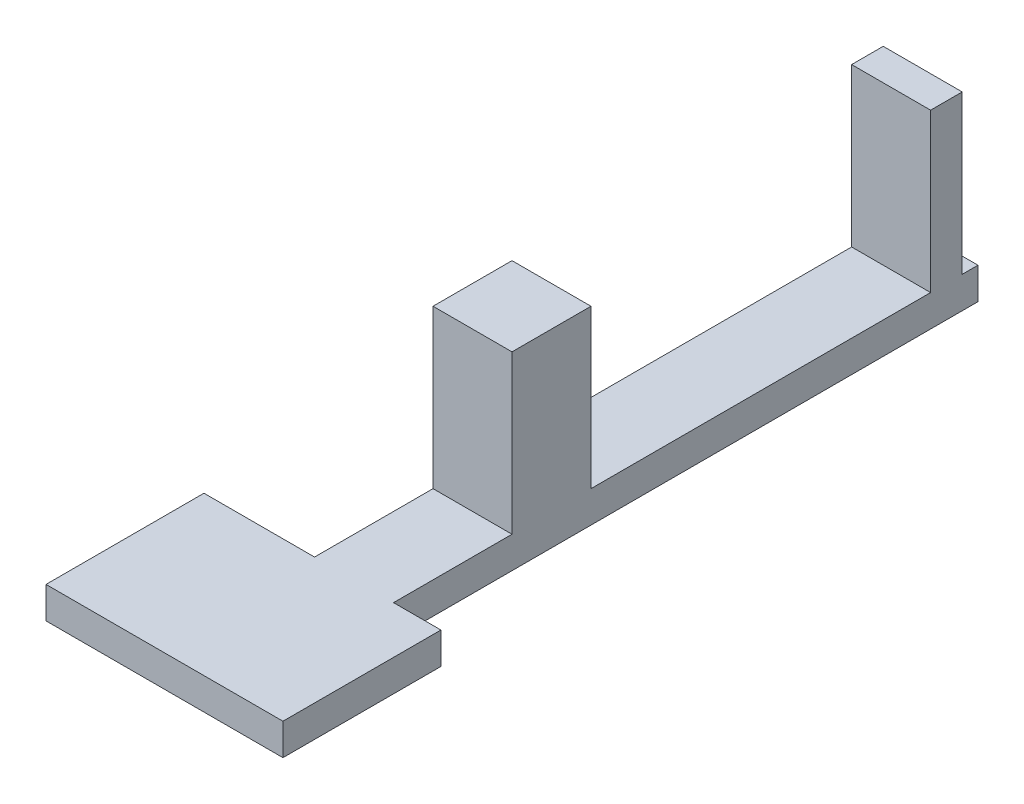
ISO-10303-21;
HEADER;
FILE_DESCRIPTION(('STEP AP214'),'2;1');
FILE_NAME('part.step','',(''),(''),'','','');
FILE_SCHEMA(('AUTOMOTIVE_DESIGN { 1 0 10303 214 1 1 1 1 }'));
ENDSEC;
DATA;
#1=APPLICATION_CONTEXT('core data for automotive mechanical design processes');
#2=APPLICATION_PROTOCOL_DEFINITION('international standard','automotive_design',2000,#1);
#3=PRODUCT_CONTEXT('',#1,'mechanical');
#4=PRODUCT('Part','Part','',(#3));
#5=PRODUCT_RELATED_PRODUCT_CATEGORY('part','',(#4));
#6=PRODUCT_DEFINITION_FORMATION('','',#4);
#7=PRODUCT_DEFINITION_CONTEXT('part definition',#1,'design');
#8=PRODUCT_DEFINITION('design','',#6,#7);
#9=PRODUCT_DEFINITION_SHAPE('','',#8);
#10=(LENGTH_UNIT() NAMED_UNIT(*) SI_UNIT(.MILLI.,.METRE.));
#11=(NAMED_UNIT(*) PLANE_ANGLE_UNIT() SI_UNIT($,.RADIAN.));
#12=(NAMED_UNIT(*) SI_UNIT($,.STERADIAN.) SOLID_ANGLE_UNIT());
#13=UNCERTAINTY_MEASURE_WITH_UNIT(LENGTH_MEASURE(1.E-05),#10,'distance_accuracy_value','');
#14=(GEOMETRIC_REPRESENTATION_CONTEXT(3) GLOBAL_UNCERTAINTY_ASSIGNED_CONTEXT((#13)) GLOBAL_UNIT_ASSIGNED_CONTEXT((#10,
#11,#12)) REPRESENTATION_CONTEXT('',''));
#15=CARTESIAN_POINT('',(0.,0.,0.));
#16=DIRECTION('',(0.,0.,1.));
#17=DIRECTION('',(1.,0.,0.));
#18=AXIS2_PLACEMENT_3D('',#15,#16,#17);
#19=CARTESIAN_POINT('',(-25.,10.,470.));
#20=DIRECTION('',(0.,-1.,0.));
#21=DIRECTION('',(0.,0.,-1.));
#22=AXIS2_PLACEMENT_3D('',#19,#20,#21);
#23=PLANE('',#22);
#24=DIRECTION('',(-1.,0.,0.));
#25=VECTOR('',#24,1.);
#26=CARTESIAN_POINT('',(-25.,10.,245.));
#27=LINE('',#26,#25);
#28=CARTESIAN_POINT('',(25.,10.,245.));
#29=VERTEX_POINT('',#28);
#30=CARTESIAN_POINT('',(-25.,10.,245.));
#31=VERTEX_POINT('',#30);
#32=EDGE_CURVE('E162',#29,#31,#27,.T.);
#33=ORIENTED_EDGE('',*,*,#32,.F.);
#34=DIRECTION('',(0.,0.,-1.));
#35=VECTOR('',#34,1.);
#36=CARTESIAN_POINT('',(25.,10.,470.));
#37=LINE('',#36,#35);
#38=CARTESIAN_POINT('',(25.,10.,30.0000000000001));
#39=VERTEX_POINT('',#38);
#40=EDGE_CURVE('E45',#29,#39,#37,.T.);
#41=ORIENTED_EDGE('',*,*,#40,.T.);
#42=DIRECTION('',(1.,0.,0.));
#43=VECTOR('',#42,1.);
#44=CARTESIAN_POINT('',(-25.,10.,30.));
#45=LINE('',#44,#43);
#46=CARTESIAN_POINT('',(-25.,10.,30.0000000000001));
#47=VERTEX_POINT('',#46);
#48=EDGE_CURVE('E475',#47,#39,#45,.T.);
#49=ORIENTED_EDGE('',*,*,#48,.F.);
#50=DIRECTION('',(0.,0.,-1.));
#51=VECTOR('',#50,1.);
#52=CARTESIAN_POINT('',(-25.,10.,470.));
#53=LINE('',#52,#51);
#54=EDGE_CURVE('E216',#31,#47,#53,.T.);
#55=ORIENTED_EDGE('',*,*,#54,.F.);
#56=EDGE_LOOP('',(#33,#41,#49,#55));
#57=FACE_BOUND('',#56,.T.);
#58=ADVANCED_FACE('F37',(#57),#23,.F.);
#59=DIRECTION('',(1.,0.,0.));
#60=VECTOR('',#59,1.);
#61=CARTESIAN_POINT('',(-25.,10.,295.));
#62=LINE('',#61,#60);
#63=CARTESIAN_POINT('',(-25.,10.,295.));
#64=VERTEX_POINT('',#63);
#65=CARTESIAN_POINT('',(25.,10.,295.));
#66=VERTEX_POINT('',#65);
#67=EDGE_CURVE('E152',#64,#66,#62,.T.);
#68=ORIENTED_EDGE('',*,*,#67,.F.);
#69=CARTESIAN_POINT('',(-25.,10.,370.));
#70=VERTEX_POINT('',#69);
#71=EDGE_CURVE('E215',#70,#64,#53,.T.);
#72=ORIENTED_EDGE('',*,*,#71,.F.);
#73=DIRECTION('',(-1.,0.,0.));
#74=VECTOR('',#73,1.);
#75=CARTESIAN_POINT('',(55.,10.,370.));
#76=LINE('',#75,#74);
#77=CARTESIAN_POINT('',(-95.,10.,370.));
#78=VERTEX_POINT('',#77);
#79=EDGE_CURVE('E181',#70,#78,#76,.T.);
#80=ORIENTED_EDGE('',*,*,#79,.T.);
#81=DIRECTION('',(0.,0.,1.));
#82=VECTOR('',#81,1.);
#83=CARTESIAN_POINT('',(-95.,10.,370.));
#84=LINE('',#83,#82);
#85=CARTESIAN_POINT('',(-94.9999999999999,10.,470.));
#86=VERTEX_POINT('',#85);
#87=EDGE_CURVE('E242',#78,#86,#84,.T.);
#88=ORIENTED_EDGE('',*,*,#87,.T.);
#89=DIRECTION('',(-1.,0.,0.));
#90=VECTOR('',#89,1.);
#91=CARTESIAN_POINT('',(-25.,10.,470.));
#92=LINE('',#91,#90);
#93=CARTESIAN_POINT('',(55.,10.,470.));
#94=VERTEX_POINT('',#93);
#95=EDGE_CURVE('E199',#94,#86,#92,.T.);
#96=ORIENTED_EDGE('',*,*,#95,.F.);
#97=DIRECTION('',(0.,0.,-1.));
#98=VECTOR('',#97,1.);
#99=CARTESIAN_POINT('',(55.,10.,370.));
#100=LINE('',#99,#98);
#101=CARTESIAN_POINT('',(55.,10.,370.));
#102=VERTEX_POINT('',#101);
#103=EDGE_CURVE('E178',#94,#102,#100,.T.);
#104=ORIENTED_EDGE('',*,*,#103,.T.);
#105=CARTESIAN_POINT('',(25.,10.,370.));
#106=VERTEX_POINT('',#105);
#107=EDGE_CURVE('E175',#102,#106,#76,.T.);
#108=ORIENTED_EDGE('',*,*,#107,.T.);
#109=EDGE_CURVE('E11',#106,#66,#37,.T.);
#110=ORIENTED_EDGE('',*,*,#109,.T.);
#111=EDGE_LOOP('',(#68,#72,#80,#88,#96,#104,#108,#110));
#112=FACE_BOUND('',#111,.T.);
#113=ADVANCED_FACE('F172',(#112),#23,.F.);
#114=DIRECTION('',(-1.,0.,0.));
#115=VECTOR('',#114,1.);
#116=CARTESIAN_POINT('',(-25.,10.,10.));
#117=LINE('',#116,#115);
#118=CARTESIAN_POINT('',(25.,10.,10.0000000000001));
#119=VERTEX_POINT('',#118);
#120=CARTESIAN_POINT('',(-25.,10.,10.));
#121=VERTEX_POINT('',#120);
#122=EDGE_CURVE('E61',#119,#121,#117,.T.);
#123=ORIENTED_EDGE('',*,*,#122,.F.);
#124=CARTESIAN_POINT('',(25.,10.,0.));
#125=VERTEX_POINT('',#124);
#126=EDGE_CURVE('E46',#119,#125,#37,.T.);
#127=ORIENTED_EDGE('',*,*,#126,.T.);
#128=DIRECTION('',(-1.,0.,0.));
#129=VECTOR('',#128,1.);
#130=CARTESIAN_POINT('',(-25.,10.,0.));
#131=LINE('',#130,#129);
#132=CARTESIAN_POINT('',(-25.,10.,0.));
#133=VERTEX_POINT('',#132);
#134=EDGE_CURVE('E192',#125,#133,#131,.T.);
#135=ORIENTED_EDGE('',*,*,#134,.T.);
#136=EDGE_CURVE('E214',#121,#133,#53,.T.);
#137=ORIENTED_EDGE('',*,*,#136,.F.);
#138=EDGE_LOOP('',(#123,#127,#135,#137));
#139=FACE_BOUND('',#138,.T.);
#140=ADVANCED_FACE('F225',(#139),#23,.F.);
#141=CARTESIAN_POINT('',(25.,10.,470.));
#142=DIRECTION('',(-1.,0.,0.));
#143=DIRECTION('',(0.,-1.,0.));
#144=AXIS2_PLACEMENT_3D('',#141,#142,#143);
#145=PLANE('',#144);
#146=ORIENTED_EDGE('',*,*,#109,.F.);
#147=DIRECTION('',(0.,-1.,0.));
#148=VECTOR('',#147,1.);
#149=CARTESIAN_POINT('',(25.,10.,370.));
#150=LINE('',#149,#148);
#151=CARTESIAN_POINT('',(25.,-10.,370.));
#152=VERTEX_POINT('',#151);
#153=EDGE_CURVE('E183',#106,#152,#150,.T.);
#154=ORIENTED_EDGE('',*,*,#153,.T.);
#155=DIRECTION('',(0.,0.,-1.));
#156=VECTOR('',#155,1.);
#157=CARTESIAN_POINT('',(25.,-10.,470.));
#158=LINE('',#157,#156);
#159=CARTESIAN_POINT('',(25.,-10.,0.));
#160=VERTEX_POINT('',#159);
#161=EDGE_CURVE('E203',#152,#160,#158,.T.);
#162=ORIENTED_EDGE('',*,*,#161,.T.);
#163=DIRECTION('',(0.,1.,0.));
#164=VECTOR('',#163,1.);
#165=CARTESIAN_POINT('',(25.,10.,0.));
#166=LINE('',#165,#164);
#167=EDGE_CURVE('E188',#160,#125,#166,.T.);
#168=ORIENTED_EDGE('',*,*,#167,.T.);
#169=ORIENTED_EDGE('',*,*,#126,.F.);
#170=DIRECTION('',(0.,-1.,0.));
#171=VECTOR('',#170,1.);
#172=CARTESIAN_POINT('',(25.,110.,10.));
#173=LINE('',#172,#171);
#174=CARTESIAN_POINT('',(25.,110.,10.));
#175=VERTEX_POINT('',#174);
#176=EDGE_CURVE('E260',#175,#119,#173,.T.);
#177=ORIENTED_EDGE('',*,*,#176,.F.);
#178=DIRECTION('',(0.,0.,-1.));
#179=VECTOR('',#178,1.);
#180=CARTESIAN_POINT('',(25.,110.,30.));
#181=LINE('',#180,#179);
#182=CARTESIAN_POINT('',(25.,110.,30.));
#183=VERTEX_POINT('',#182);
#184=EDGE_CURVE('E471',#183,#175,#181,.T.);
#185=ORIENTED_EDGE('',*,*,#184,.F.);
#186=DIRECTION('',(0.,-1.,0.));
#187=VECTOR('',#186,1.);
#188=CARTESIAN_POINT('',(25.,110.,30.));
#189=LINE('',#188,#187);
#190=EDGE_CURVE('E481',#183,#39,#189,.T.);
#191=ORIENTED_EDGE('',*,*,#190,.T.);
#192=ORIENTED_EDGE('',*,*,#40,.F.);
#193=DIRECTION('',(0.,-1.,0.));
#194=VECTOR('',#193,1.);
#195=CARTESIAN_POINT('',(25.,110.,245.));
#196=LINE('',#195,#194);
#197=CARTESIAN_POINT('',(25.,110.,245.));
#198=VERTEX_POINT('',#197);
#199=EDGE_CURVE('E460',#198,#29,#196,.T.);
#200=ORIENTED_EDGE('',*,*,#199,.F.);
#201=DIRECTION('',(0.,0.,-1.));
#202=VECTOR('',#201,1.);
#203=CARTESIAN_POINT('',(25.,110.,295.));
#204=LINE('',#203,#202);
#205=CARTESIAN_POINT('',(25.,110.,295.));
#206=VERTEX_POINT('',#205);
#207=EDGE_CURVE('E163',#206,#198,#204,.T.);
#208=ORIENTED_EDGE('',*,*,#207,.F.);
#209=DIRECTION('',(0.,-1.,0.));
#210=VECTOR('',#209,1.);
#211=CARTESIAN_POINT('',(25.,110.,295.));
#212=LINE('',#211,#210);
#213=EDGE_CURVE('E156',#206,#66,#212,.T.);
#214=ORIENTED_EDGE('',*,*,#213,.T.);
#215=EDGE_LOOP('',(#146,#154,#162,#168,#169,#177,#185,#191,#192,#200,#208,#214));
#216=FACE_BOUND('',#215,.T.);
#217=ADVANCED_FACE('F39',(#216),#145,.F.);
#218=CARTESIAN_POINT('',(-25.,10.,470.));
#219=DIRECTION('',(1.,0.,0.));
#220=DIRECTION('',(0.,1.,0.));
#221=AXIS2_PLACEMENT_3D('',#218,#219,#220);
#222=PLANE('',#221);
#223=DIRECTION('',(0.,0.,-1.));
#224=VECTOR('',#223,1.);
#225=CARTESIAN_POINT('',(-25.,-10.,470.));
#226=LINE('',#225,#224);
#227=CARTESIAN_POINT('',(-25.,-10.,370.));
#228=VERTEX_POINT('',#227);
#229=CARTESIAN_POINT('',(-25.,-10.,0.));
#230=VERTEX_POINT('',#229);
#231=EDGE_CURVE('E213',#228,#230,#226,.T.);
#232=ORIENTED_EDGE('',*,*,#231,.F.);
#233=DIRECTION('',(0.,1.,0.));
#234=VECTOR('',#233,1.);
#235=CARTESIAN_POINT('',(-25.,10.,370.));
#236=LINE('',#235,#234);
#237=EDGE_CURVE('E189',#228,#70,#236,.T.);
#238=ORIENTED_EDGE('',*,*,#237,.T.);
#239=ORIENTED_EDGE('',*,*,#71,.T.);
#240=DIRECTION('',(0.,-1.,0.));
#241=VECTOR('',#240,1.);
#242=CARTESIAN_POINT('',(-25.,110.,295.));
#243=LINE('',#242,#241);
#244=CARTESIAN_POINT('',(-25.,110.,295.));
#245=VERTEX_POINT('',#244);
#246=EDGE_CURVE('E159',#245,#64,#243,.T.);
#247=ORIENTED_EDGE('',*,*,#246,.F.);
#248=DIRECTION('',(0.,0.,1.));
#249=VECTOR('',#248,1.);
#250=CARTESIAN_POINT('',(-25.,110.,295.));
#251=LINE('',#250,#249);
#252=CARTESIAN_POINT('',(-25.,110.,245.));
#253=VERTEX_POINT('',#252);
#254=EDGE_CURVE('E468',#253,#245,#251,.T.);
#255=ORIENTED_EDGE('',*,*,#254,.F.);
#256=DIRECTION('',(0.,-1.,0.));
#257=VECTOR('',#256,1.);
#258=CARTESIAN_POINT('',(-25.,110.,245.));
#259=LINE('',#258,#257);
#260=EDGE_CURVE('E53',#253,#31,#259,.T.);
#261=ORIENTED_EDGE('',*,*,#260,.T.);
#262=ORIENTED_EDGE('',*,*,#54,.T.);
#263=DIRECTION('',(0.,-1.,0.));
#264=VECTOR('',#263,1.);
#265=CARTESIAN_POINT('',(-25.,110.,30.));
#266=LINE('',#265,#264);
#267=CARTESIAN_POINT('',(-25.,110.,30.));
#268=VERTEX_POINT('',#267);
#269=EDGE_CURVE('E265',#268,#47,#266,.T.);
#270=ORIENTED_EDGE('',*,*,#269,.F.);
#271=DIRECTION('',(0.,0.,1.));
#272=VECTOR('',#271,1.);
#273=CARTESIAN_POINT('',(-25.,110.,30.));
#274=LINE('',#273,#272);
#275=CARTESIAN_POINT('',(-25.,110.,10.));
#276=VERTEX_POINT('',#275);
#277=EDGE_CURVE('E477',#276,#268,#274,.T.);
#278=ORIENTED_EDGE('',*,*,#277,.F.);
#279=DIRECTION('',(0.,-1.,0.));
#280=VECTOR('',#279,1.);
#281=CARTESIAN_POINT('',(-25.,110.,10.));
#282=LINE('',#281,#280);
#283=EDGE_CURVE('E223',#276,#121,#282,.T.);
#284=ORIENTED_EDGE('',*,*,#283,.T.);
#285=ORIENTED_EDGE('',*,*,#136,.T.);
#286=DIRECTION('',(0.,-1.,0.));
#287=VECTOR('',#286,1.);
#288=CARTESIAN_POINT('',(-25.,10.,0.));
#289=LINE('',#288,#287);
#290=EDGE_CURVE('E207',#133,#230,#289,.T.);
#291=ORIENTED_EDGE('',*,*,#290,.T.);
#292=EDGE_LOOP('',(#232,#238,#239,#247,#255,#261,#262,#270,#278,#284,#285,#291));
#293=FACE_BOUND('',#292,.T.);
#294=ADVANCED_FACE('F218',(#293),#222,.F.);
#295=CARTESIAN_POINT('',(-25.,-10.,470.));
#296=DIRECTION('',(0.,1.,0.));
#297=DIRECTION('',(0.,0.,1.));
#298=AXIS2_PLACEMENT_3D('',#295,#296,#297);
#299=PLANE('',#298);
#300=ORIENTED_EDGE('',*,*,#161,.F.);
#301=DIRECTION('',(-1.,0.,0.));
#302=VECTOR('',#301,1.);
#303=CARTESIAN_POINT('',(55.,-10.,370.));
#304=LINE('',#303,#302);
#305=CARTESIAN_POINT('',(55.,-10.,370.));
#306=VERTEX_POINT('',#305);
#307=EDGE_CURVE('E186',#306,#152,#304,.T.);
#308=ORIENTED_EDGE('',*,*,#307,.F.);
#309=DIRECTION('',(0.,0.,-1.));
#310=VECTOR('',#309,1.);
#311=CARTESIAN_POINT('',(55.,-10.,370.));
#312=LINE('',#311,#310);
#313=CARTESIAN_POINT('',(55.,-10.,470.));
#314=VERTEX_POINT('',#313);
#315=EDGE_CURVE('E257',#314,#306,#312,.T.);
#316=ORIENTED_EDGE('',*,*,#315,.F.);
#317=DIRECTION('',(1.,0.,0.));
#318=VECTOR('',#317,1.);
#319=CARTESIAN_POINT('',(-25.,-10.,470.));
#320=LINE('',#319,#318);
#321=CARTESIAN_POINT('',(-94.9999999999999,-10.,470.));
#322=VERTEX_POINT('',#321);
#323=EDGE_CURVE('E201',#322,#314,#320,.T.);
#324=ORIENTED_EDGE('',*,*,#323,.F.);
#325=DIRECTION('',(0.,0.,1.));
#326=VECTOR('',#325,1.);
#327=CARTESIAN_POINT('',(-95.,-10.,370.));
#328=LINE('',#327,#326);
#329=CARTESIAN_POINT('',(-95.,-10.,370.));
#330=VERTEX_POINT('',#329);
#331=EDGE_CURVE('E180',#330,#322,#328,.T.);
#332=ORIENTED_EDGE('',*,*,#331,.F.);
#333=EDGE_CURVE('E233',#228,#330,#304,.T.);
#334=ORIENTED_EDGE('',*,*,#333,.F.);
#335=ORIENTED_EDGE('',*,*,#231,.T.);
#336=DIRECTION('',(1.,0.,0.));
#337=VECTOR('',#336,1.);
#338=CARTESIAN_POINT('',(-25.,-10.,0.));
#339=LINE('',#338,#337);
#340=EDGE_CURVE('E202',#230,#160,#339,.T.);
#341=ORIENTED_EDGE('',*,*,#340,.T.);
#342=EDGE_LOOP('',(#300,#308,#316,#324,#332,#334,#335,#341));
#343=FACE_BOUND('',#342,.T.);
#344=ADVANCED_FACE('F230',(#343),#299,.F.);
#345=CARTESIAN_POINT('',(0.,0.,470.));
#346=DIRECTION('',(0.,0.,1.));
#347=DIRECTION('',(1.,0.,0.));
#348=AXIS2_PLACEMENT_3D('',#345,#346,#347);
#349=PLANE('',#348);
#350=ORIENTED_EDGE('',*,*,#323,.T.);
#351=DIRECTION('',(0.,1.,0.));
#352=VECTOR('',#351,1.);
#353=CARTESIAN_POINT('',(55.,-10.,470.));
#354=LINE('',#353,#352);
#355=EDGE_CURVE('E249',#314,#94,#354,.T.);
#356=ORIENTED_EDGE('',*,*,#355,.T.);
#357=ORIENTED_EDGE('',*,*,#95,.T.);
#358=DIRECTION('',(0.,1.,0.));
#359=VECTOR('',#358,1.);
#360=CARTESIAN_POINT('',(-94.9999999999999,-10.,470.));
#361=LINE('',#360,#359);
#362=EDGE_CURVE('E251',#322,#86,#361,.T.);
#363=ORIENTED_EDGE('',*,*,#362,.F.);
#364=EDGE_LOOP('',(#350,#356,#357,#363));
#365=FACE_BOUND('',#364,.T.);
#366=ADVANCED_FACE('F274',(#365),#349,.T.);
#367=CARTESIAN_POINT('',(0.,0.,0.));
#368=DIRECTION('',(0.,0.,1.));
#369=DIRECTION('',(1.,0.,0.));
#370=AXIS2_PLACEMENT_3D('',#367,#368,#369);
#371=PLANE('',#370);
#372=ORIENTED_EDGE('',*,*,#167,.F.);
#373=ORIENTED_EDGE('',*,*,#340,.F.);
#374=ORIENTED_EDGE('',*,*,#290,.F.);
#375=ORIENTED_EDGE('',*,*,#134,.F.);
#376=EDGE_LOOP('',(#372,#373,#374,#375));
#377=FACE_BOUND('',#376,.T.);
#378=ADVANCED_FACE('F228',(#377),#371,.F.);
#379=CARTESIAN_POINT('',(-95.,-10.,370.));
#380=DIRECTION('',(-1.,0.,0.));
#381=DIRECTION('',(0.,0.,1.));
#382=AXIS2_PLACEMENT_3D('',#379,#380,#381);
#383=PLANE('',#382);
#384=ORIENTED_EDGE('',*,*,#87,.F.);
#385=DIRECTION('',(0.,1.,0.));
#386=VECTOR('',#385,1.);
#387=CARTESIAN_POINT('',(-95.,-10.,370.));
#388=LINE('',#387,#386);
#389=EDGE_CURVE('E195',#330,#78,#388,.T.);
#390=ORIENTED_EDGE('',*,*,#389,.F.);
#391=ORIENTED_EDGE('',*,*,#331,.T.);
#392=ORIENTED_EDGE('',*,*,#362,.T.);
#393=EDGE_LOOP('',(#384,#390,#391,#392));
#394=FACE_BOUND('',#393,.T.);
#395=ADVANCED_FACE('F281',(#394),#383,.T.);
#396=CARTESIAN_POINT('',(55.,-10.,370.));
#397=DIRECTION('',(0.,0.,-1.));
#398=DIRECTION('',(-1.,0.,0.));
#399=AXIS2_PLACEMENT_3D('',#396,#397,#398);
#400=PLANE('',#399);
#401=ORIENTED_EDGE('',*,*,#237,.F.);
#402=ORIENTED_EDGE('',*,*,#333,.T.);
#403=ORIENTED_EDGE('',*,*,#389,.T.);
#404=ORIENTED_EDGE('',*,*,#79,.F.);
#405=EDGE_LOOP('',(#401,#402,#403,#404));
#406=FACE_BOUND('',#405,.T.);
#407=ADVANCED_FACE('F237',(#406),#400,.T.);
#408=ORIENTED_EDGE('',*,*,#153,.F.);
#409=ORIENTED_EDGE('',*,*,#107,.F.);
#410=DIRECTION('',(0.,1.,0.));
#411=VECTOR('',#410,1.);
#412=CARTESIAN_POINT('',(55.,-10.,370.));
#413=LINE('',#412,#411);
#414=EDGE_CURVE('E247',#306,#102,#413,.T.);
#415=ORIENTED_EDGE('',*,*,#414,.F.);
#416=ORIENTED_EDGE('',*,*,#307,.T.);
#417=EDGE_LOOP('',(#408,#409,#415,#416));
#418=FACE_BOUND('',#417,.T.);
#419=ADVANCED_FACE('F184',(#418),#400,.T.);
#420=CARTESIAN_POINT('',(55.,-10.,370.));
#421=DIRECTION('',(1.,0.,0.));
#422=DIRECTION('',(0.,0.,-1.));
#423=AXIS2_PLACEMENT_3D('',#420,#421,#422);
#424=PLANE('',#423);
#425=ORIENTED_EDGE('',*,*,#103,.F.);
#426=ORIENTED_EDGE('',*,*,#355,.F.);
#427=ORIENTED_EDGE('',*,*,#315,.T.);
#428=ORIENTED_EDGE('',*,*,#414,.T.);
#429=EDGE_LOOP('',(#425,#426,#427,#428));
#430=FACE_BOUND('',#429,.T.);
#431=ADVANCED_FACE('F272',(#430),#424,.T.);
#432=CARTESIAN_POINT('',(-25.,110.,10.));
#433=DIRECTION('',(0.,0.,1.));
#434=DIRECTION('',(1.,0.,0.));
#435=AXIS2_PLACEMENT_3D('',#432,#433,#434);
#436=PLANE('',#435);
#437=ORIENTED_EDGE('',*,*,#122,.T.);
#438=ORIENTED_EDGE('',*,*,#283,.F.);
#439=DIRECTION('',(-1.,0.,0.));
#440=VECTOR('',#439,1.);
#441=CARTESIAN_POINT('',(-25.,110.,10.));
#442=LINE('',#441,#440);
#443=EDGE_CURVE('E474',#175,#276,#442,.T.);
#444=ORIENTED_EDGE('',*,*,#443,.F.);
#445=ORIENTED_EDGE('',*,*,#176,.T.);
#446=EDGE_LOOP('',(#437,#438,#444,#445));
#447=FACE_BOUND('',#446,.T.);
#448=ADVANCED_FACE('F348',(#447),#436,.F.);
#449=CARTESIAN_POINT('',(-25.,110.,30.));
#450=DIRECTION('',(0.,0.,-1.));
#451=DIRECTION('',(-1.,0.,0.));
#452=AXIS2_PLACEMENT_3D('',#449,#450,#451);
#453=PLANE('',#452);
#454=ORIENTED_EDGE('',*,*,#48,.T.);
#455=ORIENTED_EDGE('',*,*,#190,.F.);
#456=DIRECTION('',(1.,0.,0.));
#457=VECTOR('',#456,1.);
#458=CARTESIAN_POINT('',(-25.,110.,30.));
#459=LINE('',#458,#457);
#460=EDGE_CURVE('E479',#268,#183,#459,.T.);
#461=ORIENTED_EDGE('',*,*,#460,.F.);
#462=ORIENTED_EDGE('',*,*,#269,.T.);
#463=EDGE_LOOP('',(#454,#455,#461,#462));
#464=FACE_BOUND('',#463,.T.);
#465=ADVANCED_FACE('F395',(#464),#453,.F.);
#466=CARTESIAN_POINT('',(0.,110.,0.));
#467=DIRECTION('',(0.,-1.,0.));
#468=DIRECTION('',(0.,0.,-1.));
#469=AXIS2_PLACEMENT_3D('',#466,#467,#468);
#470=PLANE('',#469);
#471=ORIENTED_EDGE('',*,*,#184,.T.);
#472=ORIENTED_EDGE('',*,*,#443,.T.);
#473=ORIENTED_EDGE('',*,*,#277,.T.);
#474=ORIENTED_EDGE('',*,*,#460,.T.);
#475=EDGE_LOOP('',(#471,#472,#473,#474));
#476=FACE_BOUND('',#475,.T.);
#477=ADVANCED_FACE('F406',(#476),#470,.F.);
#478=CARTESIAN_POINT('',(-25.,110.,245.));
#479=DIRECTION('',(0.,0.,1.));
#480=DIRECTION('',(1.,0.,0.));
#481=AXIS2_PLACEMENT_3D('',#478,#479,#480);
#482=PLANE('',#481);
#483=ORIENTED_EDGE('',*,*,#32,.T.);
#484=ORIENTED_EDGE('',*,*,#260,.F.);
#485=DIRECTION('',(-1.,0.,0.));
#486=VECTOR('',#485,1.);
#487=CARTESIAN_POINT('',(-25.,110.,245.));
#488=LINE('',#487,#486);
#489=EDGE_CURVE('E457',#198,#253,#488,.T.);
#490=ORIENTED_EDGE('',*,*,#489,.F.);
#491=ORIENTED_EDGE('',*,*,#199,.T.);
#492=EDGE_LOOP('',(#483,#484,#490,#491));
#493=FACE_BOUND('',#492,.T.);
#494=ADVANCED_FACE('F417',(#493),#482,.F.);
#495=CARTESIAN_POINT('',(-25.,110.,295.));
#496=DIRECTION('',(0.,0.,-1.));
#497=DIRECTION('',(-1.,0.,0.));
#498=AXIS2_PLACEMENT_3D('',#495,#496,#497);
#499=PLANE('',#498);
#500=ORIENTED_EDGE('',*,*,#67,.T.);
#501=ORIENTED_EDGE('',*,*,#213,.F.);
#502=DIRECTION('',(1.,0.,0.));
#503=VECTOR('',#502,1.);
#504=CARTESIAN_POINT('',(-25.,110.,295.));
#505=LINE('',#504,#503);
#506=EDGE_CURVE('E170',#245,#206,#505,.T.);
#507=ORIENTED_EDGE('',*,*,#506,.F.);
#508=ORIENTED_EDGE('',*,*,#246,.T.);
#509=EDGE_LOOP('',(#500,#501,#507,#508));
#510=FACE_BOUND('',#509,.T.);
#511=ADVANCED_FACE('F154',(#510),#499,.F.);
#512=CARTESIAN_POINT('',(0.,110.,0.));
#513=DIRECTION('',(0.,-1.,0.));
#514=DIRECTION('',(0.,0.,-1.));
#515=AXIS2_PLACEMENT_3D('',#512,#513,#514);
#516=PLANE('',#515);
#517=ORIENTED_EDGE('',*,*,#207,.T.);
#518=ORIENTED_EDGE('',*,*,#489,.T.);
#519=ORIENTED_EDGE('',*,*,#254,.T.);
#520=ORIENTED_EDGE('',*,*,#506,.T.);
#521=EDGE_LOOP('',(#517,#518,#519,#520));
#522=FACE_BOUND('',#521,.T.);
#523=ADVANCED_FACE('F438',(#522),#516,.F.);
#524=CLOSED_SHELL('',(#58,#113,#140,#217,#294,#344,#366,#378,#395,#407,#419,#431,#448,#465,#477,
#494,#511,#523));
#525=MANIFOLD_SOLID_BREP('B2',#524);
#526=ADVANCED_BREP_SHAPE_REPRESENTATION('',(#18,#525),#14);
#527=SHAPE_DEFINITION_REPRESENTATION(#9,#526);
ENDSEC;
END-ISO-10303-21;
